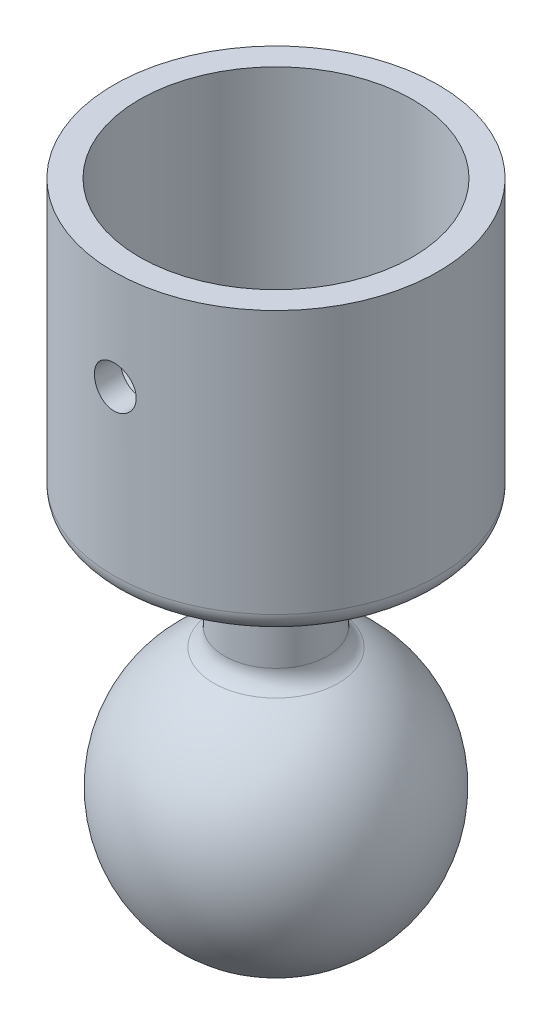
ISO-10303-21;
HEADER;
FILE_DESCRIPTION(('STEP AP214'),'2;1');
FILE_NAME('part.step','',(''),(''),'','','');
FILE_SCHEMA(('AUTOMOTIVE_DESIGN { 1 0 10303 214 1 1 1 1 }'));
ENDSEC;
DATA;
#1=APPLICATION_CONTEXT('core data for automotive mechanical design processes');
#2=APPLICATION_PROTOCOL_DEFINITION('international standard','automotive_design',2000,#1);
#3=PRODUCT_CONTEXT('',#1,'mechanical');
#4=PRODUCT('Part','Part','',(#3));
#5=PRODUCT_RELATED_PRODUCT_CATEGORY('part','',(#4));
#6=PRODUCT_DEFINITION_FORMATION('','',#4);
#7=PRODUCT_DEFINITION_CONTEXT('part definition',#1,'design');
#8=PRODUCT_DEFINITION('design','',#6,#7);
#9=PRODUCT_DEFINITION_SHAPE('','',#8);
#10=(LENGTH_UNIT() NAMED_UNIT(*) SI_UNIT(.MILLI.,.METRE.));
#11=(NAMED_UNIT(*) PLANE_ANGLE_UNIT() SI_UNIT($,.RADIAN.));
#12=(NAMED_UNIT(*) SI_UNIT($,.STERADIAN.) SOLID_ANGLE_UNIT());
#13=UNCERTAINTY_MEASURE_WITH_UNIT(LENGTH_MEASURE(1.E-05),#10,'distance_accuracy_value','');
#14=(GEOMETRIC_REPRESENTATION_CONTEXT(3) GLOBAL_UNCERTAINTY_ASSIGNED_CONTEXT((#13)) GLOBAL_UNIT_ASSIGNED_CONTEXT((#10,
#11,#12)) REPRESENTATION_CONTEXT('',''));
#15=CARTESIAN_POINT('',(0.,0.,0.));
#16=DIRECTION('',(0.,0.,1.));
#17=DIRECTION('',(1.,0.,0.));
#18=AXIS2_PLACEMENT_3D('',#15,#16,#17);
#19=CARTESIAN_POINT('',(0.,40.,0.));
#20=DIRECTION('',(0.,-1.,0.));
#21=DIRECTION('',(0.,0.,-1.));
#22=AXIS2_PLACEMENT_3D('',#19,#20,#21);
#23=CYLINDRICAL_SURFACE('',#22,20.);
#24=CARTESIAN_POINT('',(0.,32.5,0.));
#25=DIRECTION('',(0.,1.,0.));
#26=DIRECTION('',(0.,0.,1.));
#27=AXIS2_PLACEMENT_3D('',#24,#25,#26);
#28=CIRCLE('',#27,20.);
#29=CARTESIAN_POINT('',(0.,32.5,20.));
#30=VERTEX_POINT('',#29);
#31=EDGE_CURVE('E51',#30,#30,#28,.T.);
#32=ORIENTED_EDGE('',*,*,#31,.T.);
#33=EDGE_LOOP('',(#32));
#34=FACE_BOUND('',#33,.T.);
#35=CARTESIAN_POINT('',(0.,65.,0.));
#36=DIRECTION('',(0.,1.,0.));
#37=DIRECTION('',(0.,0.,1.));
#38=AXIS2_PLACEMENT_3D('',#35,#36,#37);
#39=CIRCLE('',#38,20.);
#40=CARTESIAN_POINT('',(0.,65.,20.));
#41=VERTEX_POINT('',#40);
#42=EDGE_CURVE('E63',#41,#41,#39,.T.);
#43=ORIENTED_EDGE('',*,*,#42,.F.);
#44=EDGE_LOOP('',(#43));
#45=FACE_BOUND('',#44,.T.);
#46=CARTESIAN_POINT('',(0.,50.1203125,20.));
#47=CARTESIAN_POINT('',(0.144259684089604,50.1203186046684,19.9999979355658));
#48=CARTESIAN_POINT('',(0.288608567722076,50.1324541088101,19.9984227203245));
#49=CARTESIAN_POINT('',(0.57328694042105,50.1806719405937,19.9922904047066));
#50=CARTESIAN_POINT('',(0.713612117704079,50.2167790240216,19.9877302217806));
#51=CARTESIAN_POINT('',(0.986080772686099,50.3118562299888,19.9761415135883));
#52=CARTESIAN_POINT('',(1.11822978622637,50.3708106823734,19.9691146804156));
#53=CARTESIAN_POINT('',(1.37073416617991,50.5098742330933,19.9533734489139));
#54=CARTESIAN_POINT('',(1.49109149384735,50.5899798052472,19.9446593319427));
#55=CARTESIAN_POINT('',(1.71732404484239,50.7695721164172,19.9264589155304));
#56=CARTESIAN_POINT('',(1.82312037976386,50.8691578568412,19.9169688222111));
#57=CARTESIAN_POINT('',(2.01654817617346,51.0846709675932,19.8983165014246));
#58=CARTESIAN_POINT('',(2.10417869520908,51.200599185254,19.8891542909885));
#59=CARTESIAN_POINT('',(2.25908326694745,51.4460218544909,19.8721578766512));
#60=CARTESIAN_POINT('',(2.32628303386291,51.57556356128,19.8643285634699));
#61=CARTESIAN_POINT('',(2.43794409501457,51.8442116395449,19.8509347478902));
#62=CARTESIAN_POINT('',(2.48240630634559,51.9833176249991,19.8453701541487));
#63=CARTESIAN_POINT('',(2.54708958715884,52.2663249936135,19.837172241303));
#64=CARTESIAN_POINT('',(2.56744416471193,52.4101953869017,19.8345227840315));
#65=CARTESIAN_POINT('',(2.58374757667867,52.6993325245959,19.8324058050349));
#66=CARTESIAN_POINT('',(2.57969745403279,52.8445992090662,19.8329381473349));
#67=CARTESIAN_POINT('',(2.54741595459848,53.1314730438549,19.8371098511547));
#68=CARTESIAN_POINT('',(2.5193318809142,53.2730970844133,19.8407302854398));
#69=CARTESIAN_POINT('',(2.44000962377564,53.5496053548005,19.8506407147159));
#70=CARTESIAN_POINT('',(2.38877094348664,53.6844894399393,19.8569307669896));
#71=CARTESIAN_POINT('',(2.26443638275144,53.9441451538924,19.8714930816405));
#72=CARTESIAN_POINT('',(2.19127673027484,54.068885909094,19.8797711132632));
#73=CARTESIAN_POINT('',(2.02522254887564,54.3043756367099,19.8973722462461));
#74=CARTESIAN_POINT('',(1.93232705916395,54.415123927518,19.9066953984749));
#75=CARTESIAN_POINT('',(1.7286229537854,54.620339798171,19.9254203525415));
#76=CARTESIAN_POINT('',(1.61768741696047,54.7146814308242,19.9348222278098));
#77=CARTESIAN_POINT('',(1.38148861925346,54.8834245104817,19.9525810859224));
#78=CARTESIAN_POINT('',(1.25622532158365,54.957825906286,19.9609380660839));
#79=CARTESIAN_POINT('',(0.994827864690191,55.0845775601328,19.9756711983466));
#80=CARTESIAN_POINT('',(0.858689706852809,55.136919662311,19.9820466175877));
#81=CARTESIAN_POINT('',(0.579455954793333,55.2179655479392,19.9920917353578));
#82=CARTESIAN_POINT('',(0.436360707899851,55.2466705101791,19.995761568814));
#83=CARTESIAN_POINT('',(0.148363430686238,55.27946342583,19.9999644376216));
#84=CARTESIAN_POINT('',(0.0034814598698716,55.283724825918,20.0005195736327));
#85=CARTESIAN_POINT('',(-0.284930877059284,55.2679677712994,19.9984902419318));
#86=CARTESIAN_POINT('',(-0.428461273790265,55.2479498679496,19.9959058455152));
#87=CARTESIAN_POINT('',(-0.709582370288303,55.1843465561075,19.9879015871917));
#88=CARTESIAN_POINT('',(-0.847192149932119,55.1408441154564,19.9824917095215));
#89=CARTESIAN_POINT('',(-1.11316341629269,55.0315930443956,19.9694419866011));
#90=CARTESIAN_POINT('',(-1.24152457038789,54.9658436143696,19.9618020611984));
#91=CARTESIAN_POINT('',(-1.4861277538227,54.8135471890215,19.9450884901062));
#92=CARTESIAN_POINT('',(-1.60229959611558,54.7268883170114,19.9360072250942));
#93=CARTESIAN_POINT('',(-1.81851173147554,54.5353908354827,19.9174499633749));
#94=CARTESIAN_POINT('',(-1.91855134074004,54.4305514557314,19.9079739499567));
#95=CARTESIAN_POINT('',(-2.1002769737112,54.2049037084931,19.8896267261291));
#96=CARTESIAN_POINT('',(-2.18184782719895,54.0840022134656,19.8807595388864));
#97=CARTESIAN_POINT('',(-2.32352409072991,53.8301127942107,19.8647008799258));
#98=CARTESIAN_POINT('',(-2.38362995436432,53.6971251254589,19.8575093727991));
#99=CARTESIAN_POINT('',(-2.48048476164498,53.4232058275026,19.8456440026552));
#100=CARTESIAN_POINT('',(-2.51729799828203,53.282297244399,19.8409632149697));
#101=CARTESIAN_POINT('',(-2.56672927631033,52.996233951436,19.834629618848));
#102=CARTESIAN_POINT('',(-2.57934852229131,52.8510794533409,19.8329766596601));
#103=CARTESIAN_POINT('',(-2.58001053460691,52.5617908061595,19.8328904574174));
#104=CARTESIAN_POINT('',(-2.56823425374488,52.4176570448908,19.8344335080784));
#105=CARTESIAN_POINT('',(-2.52082336128995,52.133436021762,19.8405144140881));
#106=CARTESIAN_POINT('',(-2.48518875239719,51.993348759444,19.845052269098));
#107=CARTESIAN_POINT('',(-2.39113044257469,51.7212250328605,19.8566040077216));
#108=CARTESIAN_POINT('',(-2.33271604685648,51.5891853067262,19.8636168802158));
#109=CARTESIAN_POINT('',(-2.19477412073822,51.3367526138156,19.8793300765957));
#110=CARTESIAN_POINT('',(-2.11524625827741,51.2163598302565,19.8880304270207));
#111=CARTESIAN_POINT('',(-1.93666548925043,50.9897142735576,19.906215529831));
#112=CARTESIAN_POINT('',(-1.83747781495568,50.883568091808,19.9157054182349));
#113=CARTESIAN_POINT('',(-1.62267509948175,50.6893583265491,19.9343553319995));
#114=CARTESIAN_POINT('',(-1.50705620000392,50.6012990020152,19.9435152792501));
#115=CARTESIAN_POINT('',(-1.26213407745754,50.4454566910302,19.9605144089472));
#116=CARTESIAN_POINT('',(-1.1327774026676,50.3777571473775,19.9683481000762));
#117=CARTESIAN_POINT('',(-0.864500555958517,50.2651396143564,19.9817567924104));
#118=CARTESIAN_POINT('',(-0.725590889315517,50.2201970405049,19.9873342297434));
#119=CARTESIAN_POINT('',(-0.488313325320549,50.1650448423145,19.9942679251742));
#120=CARTESIAN_POINT('',(-0.391437409634517,50.1482945437591,19.9964068984281));
#121=CARTESIAN_POINT('',(-0.19638810409893,50.1259263392644,19.9992736329212));
#122=CARTESIAN_POINT('',(-0.0982147246868387,50.1203083438261,20.0000014055059));
#123=CARTESIAN_POINT('',(0.,50.1203125,20.));
#124=B_SPLINE_CURVE_WITH_KNOTS('',3,(#46,#47,#48,#49,#50,#51,#52,#53,#54,#55,#56,#57,#58,#59,
#60,#61,#62,#63,#64,#65,#66,#67,#68,#69,#70,#71,#72,#73,#74,#75,#76,#77,#78,#79,#80,#81,#82,#83,
#84,#85,#86,#87,#88,#89,#90,#91,#92,#93,#94,#95,#96,#97,#98,#99,#100,#101,#102,#103,#104,#105,
#106,#107,#108,#109,#110,#111,#112,#113,#114,#115,#116,#117,#118,#119,#120,#121,#122,#123),
.UNSPECIFIED.,.T.,.F.,(4,2,2,2,2,2,2,2,2,2,2,2,2,2,2,2,2,2,2,2,2,2,2,2,2,2,2,2,2,2,2,2,2,2,2,2,
2,2,4),(0.,0.432420284850133,0.865287832278834,1.29785901599462,1.73035812965382,
2.1651152260535,2.59989487224849,3.03623696604836,3.47256145907105,3.90645811724559,
4.34033623287797,4.77157401739153,5.20282105553137,5.63533505466974,6.06787011448015,
6.50359157764934,6.9393141595949,7.3751976978846,7.81105949724396,8.24382464462087,
8.67657996455437,9.10781632654163,9.5390681899662,9.97268074705462,10.4063116790014,
10.8425764792745,11.2788320599957,11.7138781609775,12.1489026009739,12.5807118218453,
13.0125209938474,13.4441539625367,13.8757937201092,14.3105016142397,14.7453117534964,
15.1818803720755,15.617976351481,15.912378636772,16.2067785551802),.UNSPECIFIED.);
#125=CARTESIAN_POINT('',(0.,50.1203125,20.));
#126=VERTEX_POINT('',#125);
#127=EDGE_CURVE('E69',#126,#126,#124,.T.);
#128=ORIENTED_EDGE('',*,*,#127,.F.);
#129=EDGE_LOOP('',(#128));
#130=FACE_BOUND('',#129,.T.);
#131=ADVANCED_FACE('F30',(#34,#45,#130),#23,.T.);
#132=CARTESIAN_POINT('',(0.,65.,0.));
#133=DIRECTION('',(0.,-1.,0.));
#134=DIRECTION('',(0.,0.,-1.));
#135=AXIS2_PLACEMENT_3D('',#132,#133,#134);
#136=CYLINDRICAL_SURFACE('',#135,16.85);
#137=CARTESIAN_POINT('',(0.,40.,0.));
#138=DIRECTION('',(0.,1.,0.));
#139=DIRECTION('',(0.,0.,1.));
#140=AXIS2_PLACEMENT_3D('',#137,#138,#139);
#141=CIRCLE('',#140,16.85);
#142=CARTESIAN_POINT('',(0.,40.,16.85));
#143=VERTEX_POINT('',#142);
#144=EDGE_CURVE('E54',#143,#143,#141,.F.);
#145=ORIENTED_EDGE('',*,*,#144,.T.);
#146=EDGE_LOOP('',(#145));
#147=FACE_BOUND('',#146,.T.);
#148=CARTESIAN_POINT('',(0.,65.,0.));
#149=DIRECTION('',(0.,1.,0.));
#150=DIRECTION('',(0.,0.,1.));
#151=AXIS2_PLACEMENT_3D('',#148,#149,#150);
#152=CIRCLE('',#151,16.85);
#153=CARTESIAN_POINT('',(0.,65.,16.85));
#154=VERTEX_POINT('',#153);
#155=EDGE_CURVE('E66',#154,#154,#152,.T.);
#156=ORIENTED_EDGE('',*,*,#155,.T.);
#157=EDGE_LOOP('',(#156));
#158=FACE_BOUND('',#157,.T.);
#159=CARTESIAN_POINT('',(-2.5796875,52.7,16.6513576744464));
#160=CARTESIAN_POINT('',(-2.57968157967421,52.5560117891578,16.6513601193928));
#161=CARTESIAN_POINT('',(-2.56759142326191,52.4119408757347,16.6532455388782));
#162=CARTESIAN_POINT('',(-2.5195645331354,52.1278296639703,16.6605780818208));
#163=CARTESIAN_POINT('',(-2.48360476566806,51.9877933953154,16.6660286455049));
#164=CARTESIAN_POINT('',(-2.38894189563946,51.7159049080579,16.6798599924652));
#165=CARTESIAN_POINT('',(-2.3302565234872,51.5840464020199,16.6882384908847));
#166=CARTESIAN_POINT('',(-2.19185050225866,51.332065831323,16.706978951984));
#167=CARTESIAN_POINT('',(-2.11213265451573,51.2119422066027,16.7173406504694));
#168=CARTESIAN_POINT('',(-1.93321511380975,50.9858221759533,16.7389765637315));
#169=CARTESIAN_POINT('',(-1.83387460944099,50.8799377686702,16.7502570056408));
#170=CARTESIAN_POINT('',(-1.61883577654572,50.6862728029344,16.7724038523746));
#171=CARTESIAN_POINT('',(-1.50313653700671,50.5984932534051,16.7832702340974));
#172=CARTESIAN_POINT('',(-1.25794550140128,50.4431152003564,16.8034299033076));
#173=CARTESIAN_POINT('',(-1.12838749238576,50.3756200343325,16.812715034675));
#174=CARTESIAN_POINT('',(-0.859607783480885,50.2633900293106,16.82859699072));
#175=CARTESIAN_POINT('',(-0.72038661555025,50.2186539385488,16.8351939632441));
#176=CARTESIAN_POINT('',(-0.437386706365017,50.1535520497785,16.8449123654646));
#177=CARTESIAN_POINT('',(-0.293652070425817,50.1329985826942,16.8480605461379));
#178=CARTESIAN_POINT('',(-0.0047420001546173,50.1162625023987,16.8506183742518));
#179=CARTESIAN_POINT('',(0.140433350417029,50.1200784805871,16.8500282377743));
#180=CARTESIAN_POINT('',(0.426822972858375,50.1518251788889,16.8451972629109));
#181=CARTESIAN_POINT('',(0.568060216171563,50.1795539846139,16.8409869929724));
#182=CARTESIAN_POINT('',(0.843853119854773,50.2580220993676,16.8294228758527));
#183=CARTESIAN_POINT('',(0.978408602356649,50.3087620205872,16.8220689450375));
#184=CARTESIAN_POINT('',(1.23762769104119,50.4320176731761,16.8049913420397));
#185=CARTESIAN_POINT('',(1.36225040292763,50.5046180846612,16.7952584828073));
#186=CARTESIAN_POINT('',(1.59762049691591,50.6694719958899,16.7745071444088));
#187=CARTESIAN_POINT('',(1.70836692734892,50.7617268424117,16.7634885771657));
#188=CARTESIAN_POINT('',(1.9140314902412,50.9643947945324,16.7412608066833));
#189=CARTESIAN_POINT('',(2.00877586574088,51.0749842233435,16.7300508068331));
#190=CARTESIAN_POINT('',(2.17838917601242,51.3105839390219,16.708813541843));
#191=CARTESIAN_POINT('',(2.2532579785036,51.435594321859,16.698786284575));
#192=CARTESIAN_POINT('',(2.38102026538037,51.6966721046894,16.6810499222785));
#193=CARTESIAN_POINT('',(2.43389534492257,51.8327486517282,16.6733427602421));
#194=CARTESIAN_POINT('',(2.51599155658888,52.111995338699,16.6611531816711));
#195=CARTESIAN_POINT('',(2.54521442899459,52.2551649559145,16.6566705278865));
#196=CARTESIAN_POINT('',(2.5789372602295,52.542986228322,16.6514826692861));
#197=CARTESIAN_POINT('',(2.58368377694979,52.6876083396462,16.6507397943391));
#198=CARTESIAN_POINT('',(2.56897389237175,52.9755823392936,16.6530155343492));
#199=CARTESIAN_POINT('',(2.54951827454785,53.1189342685839,16.6560340275428));
#200=CARTESIAN_POINT('',(2.48716570709591,53.3995313782231,16.6654577553682));
#201=CARTESIAN_POINT('',(2.44439206836594,53.5368046109532,16.6718451686736));
#202=CARTESIAN_POINT('',(2.33674610487353,53.8022333358894,16.6872722925654));
#203=CARTESIAN_POINT('',(2.27187264702997,53.930388360188,16.6963121391416));
#204=CARTESIAN_POINT('',(2.12127804855136,54.1750466539058,16.7161140969022));
#205=CARTESIAN_POINT('',(2.03539758917819,54.2914507926094,16.7268891438742));
#206=CARTESIAN_POINT('',(1.84544779389639,54.5082829474892,16.7489086676992));
#207=CARTESIAN_POINT('',(1.74137738513499,54.608710020662,16.7601531722112));
#208=CARTESIAN_POINT('',(1.51691486460429,54.7916254075028,16.781962624799));
#209=CARTESIAN_POINT('',(1.39638869410322,54.8739501380958,16.7925208134363));
#210=CARTESIAN_POINT('',(1.14307426939715,55.0171831540418,16.8116623765315));
#211=CARTESIAN_POINT('',(1.01028636209344,55.0780920450438,16.8202458068339));
#212=CARTESIAN_POINT('',(0.736724124830476,55.1765042378415,16.8344411588415));
#213=CARTESIAN_POINT('',(0.595982332541899,55.2140962942127,16.8400643361023));
#214=CARTESIAN_POINT('',(0.310091151156388,55.2650947076306,16.8477529105713));
#215=CARTESIAN_POINT('',(0.164942066548349,55.2785027316436,16.8498185529942));
#216=CARTESIAN_POINT('',(-0.124058259668895,55.2807104902222,16.850156678919));
#217=CARTESIAN_POINT('',(-0.267907608346202,55.2697602670688,16.8484677044299));
#218=CARTESIAN_POINT('',(-0.551693648926051,55.2240991901315,16.8415642602314));
#219=CARTESIAN_POINT('',(-0.691630354903202,55.1893884218307,16.8363498032057));
#220=CARTESIAN_POINT('',(-0.963545346548327,55.0972815892991,16.8229786717156));
#221=CARTESIAN_POINT('',(-1.09552985920403,55.0399035479742,16.8148243352187));
#222=CARTESIAN_POINT('',(-1.34803730890427,54.9041177862351,16.7964681050336));
#223=CARTESIAN_POINT('',(-1.46855984255124,54.8257093260386,16.7862661393195));
#224=CARTESIAN_POINT('',(-1.69598887741392,54.6491874502967,16.7648237540217));
#225=CARTESIAN_POINT('',(-1.80275143757677,54.5508896753464,16.7535741936668));
#226=CARTESIAN_POINT('',(-1.99835664189189,54.3377673383239,16.7313713398338));
#227=CARTESIAN_POINT('',(-2.08719507707872,54.2229389053237,16.7204181164635));
#228=CARTESIAN_POINT('',(-2.24490073995654,53.9792204426527,16.6999790428046));
#229=CARTESIAN_POINT('',(-2.31364764709779,53.8502518108205,16.6905021855719));
#230=CARTESIAN_POINT('',(-2.42840046541223,53.5825123558706,16.6741944207696));
#231=CARTESIAN_POINT('',(-2.47442982022739,53.4437518074219,16.667360787077));
#232=CARTESIAN_POINT('',(-2.5320743595584,53.203651991667,16.6586807975601));
#233=CARTESIAN_POINT('',(-2.54990173420719,53.1037907173974,16.6559493117517));
#234=CARTESIAN_POINT('',(-2.57371030593733,52.9026332701896,16.6522869022691));
#235=CARTESIAN_POINT('',(-2.57969166665187,52.8013371170912,16.6513559537234));
#236=CARTESIAN_POINT('',(-2.5796875,52.7,16.6513576744464));
#237=B_SPLINE_CURVE_WITH_KNOTS('',3,(#159,#160,#161,#162,#163,#164,#165,#166,#167,#168,#169,
#170,#171,#172,#173,#174,#175,#176,#177,#178,#179,#180,#181,#182,#183,#184,#185,#186,#187,#188,
#189,#190,#191,#192,#193,#194,#195,#196,#197,#198,#199,#200,#201,#202,#203,#204,#205,#206,#207,
#208,#209,#210,#211,#212,#213,#214,#215,#216,#217,#218,#219,#220,#221,#222,#223,#224,#225,#226,
#227,#228,#229,#230,#231,#232,#233,#234,#235,#236),.UNSPECIFIED.,.T.,.F.,(4,2,2,2,2,2,2,2,2,2,2,
2,2,2,2,2,2,2,2,2,2,2,2,2,2,2,2,2,2,2,2,2,2,2,2,2,2,2,4),(0.,0.43159420374436,0.863605494912892,
1.29528040979586,1.72689785852863,2.16173312695301,2.59659262075331,3.03363132181571,
3.47064598286757,3.90424634433128,4.33782164309501,4.76777138356791,5.19773256315312,
5.629381174259,6.06105937268234,6.4971594487158,6.93326242711418,7.36972961567811,
7.80616468694837,8.23819470296168,8.67021073361109,9.09996402132547,9.52973934626268,
9.96288108414527,10.3960483775813,10.832982346047,11.2699039568387,11.7051520695721,
12.1403701802072,12.5711413273695,13.0019109247568,13.4323387013862,13.8627816210651,
14.2974140134809,14.7321483483374,15.1694351626039,15.6062697651583,15.9100246091518,
16.2137752572425),.UNSPECIFIED.);
#238=CARTESIAN_POINT('',(-2.5796875,52.7,16.6513576744464));
#239=VERTEX_POINT('',#238);
#240=EDGE_CURVE('E34',#239,#239,#237,.T.);
#241=ORIENTED_EDGE('',*,*,#240,.T.);
#242=EDGE_LOOP('',(#241));
#243=FACE_BOUND('',#242,.T.);
#244=ADVANCED_FACE('F81',(#147,#158,#243),#136,.F.);
#245=CARTESIAN_POINT('',(0.,0.,0.));
#246=DIRECTION('',(0.,0.,-1.));
#247=DIRECTION('',(1.,0.,0.));
#248=AXIS2_PLACEMENT_3D('',#245,#246,#247);
#249=SPHERICAL_SURFACE('',#248,16.75);
#250=CARTESIAN_POINT('',(0.,0.,0.));
#251=DIRECTION('',(0.,-1.,0.));
#252=DIRECTION('',(0.,0.,-1.));
#253=AXIS2_PLACEMENT_3D('',#250,#251,#252);
#254=SPHERICAL_SURFACE('',#253,16.75);
#255=CARTESIAN_POINT('',(0.,14.8748949434389,0.));
#256=DIRECTION('',(0.,-1.,0.));
#257=DIRECTION('',(0.,0.,-1.));
#258=AXIS2_PLACEMENT_3D('',#255,#256,#257);
#259=CIRCLE('',#258,7.70064935064935);
#260=CARTESIAN_POINT('',(0.,14.8748949434389,-7.70064935064935));
#261=VERTEX_POINT('',#260);
#262=EDGE_CURVE('E10',#261,#261,#259,.T.);
#263=ORIENTED_EDGE('',*,*,#262,.T.);
#264=EDGE_LOOP('',(#263));
#265=FACE_BOUND('',#264,.T.);
#266=ADVANCED_FACE('F86',(#265),#254,.T.);
#267=CARTESIAN_POINT('',(0.,30.,0.));
#268=DIRECTION('',(0.,-1.,0.));
#269=DIRECTION('',(0.,0.,-1.));
#270=AXIS2_PLACEMENT_3D('',#267,#268,#269);
#271=CYLINDRICAL_SURFACE('',#270,6.35);
#272=CARTESIAN_POINT('',(0.,17.0950285170865,0.));
#273=DIRECTION('',(0.,-1.,0.));
#274=DIRECTION('',(0.,0.,-1.));
#275=AXIS2_PLACEMENT_3D('',#272,#273,#274);
#276=CIRCLE('',#275,6.35);
#277=CARTESIAN_POINT('',(0.,17.0950285170865,-6.35));
#278=VERTEX_POINT('',#277);
#279=EDGE_CURVE('E42',#278,#278,#276,.F.);
#280=ORIENTED_EDGE('',*,*,#279,.T.);
#281=EDGE_LOOP('',(#280));
#282=FACE_BOUND('',#281,.T.);
#283=CARTESIAN_POINT('',(0.,26.1,0.));
#284=DIRECTION('',(0.,1.,0.));
#285=DIRECTION('',(0.,0.,1.));
#286=AXIS2_PLACEMENT_3D('',#283,#284,#285);
#287=CIRCLE('',#286,6.35);
#288=CARTESIAN_POINT('',(0.,26.1,6.35));
#289=VERTEX_POINT('',#288);
#290=EDGE_CURVE('E57',#289,#289,#287,.F.);
#291=ORIENTED_EDGE('',*,*,#290,.T.);
#292=EDGE_LOOP('',(#291));
#293=FACE_BOUND('',#292,.T.);
#294=ADVANCED_FACE('F99',(#282,#293),#271,.T.);
#295=CARTESIAN_POINT('',(0.,30.,0.));
#296=DIRECTION('',(0.,1.,0.));
#297=DIRECTION('',(0.,0.,1.));
#298=AXIS2_PLACEMENT_3D('',#295,#296,#297);
#299=PLANE('',#298);
#300=CARTESIAN_POINT('',(0.,30.,0.));
#301=DIRECTION('',(0.,1.,0.));
#302=DIRECTION('',(0.,0.,1.));
#303=AXIS2_PLACEMENT_3D('',#300,#301,#302);
#304=CIRCLE('',#303,17.5);
#305=CARTESIAN_POINT('',(0.,30.,17.5));
#306=VERTEX_POINT('',#305);
#307=EDGE_CURVE('E46',#306,#306,#304,.F.);
#308=ORIENTED_EDGE('',*,*,#307,.T.);
#309=EDGE_LOOP('',(#308));
#310=FACE_BOUND('',#309,.T.);
#311=CARTESIAN_POINT('',(0.,30.,0.));
#312=DIRECTION('',(0.,1.,0.));
#313=DIRECTION('',(0.,0.,1.));
#314=AXIS2_PLACEMENT_3D('',#311,#312,#313);
#315=CIRCLE('',#314,10.25);
#316=CARTESIAN_POINT('',(0.,30.,10.25));
#317=VERTEX_POINT('',#316);
#318=EDGE_CURVE('E60',#317,#317,#315,.T.);
#319=ORIENTED_EDGE('',*,*,#318,.T.);
#320=EDGE_LOOP('',(#319));
#321=FACE_BOUND('',#320,.T.);
#322=ADVANCED_FACE('F97',(#310,#321),#299,.F.);
#323=CARTESIAN_POINT('',(0.,26.1,0.));
#324=DIRECTION('',(0.,1.,0.));
#325=DIRECTION('',(0.,0.,1.));
#326=AXIS2_PLACEMENT_3D('',#323,#324,#325);
#327=TOROIDAL_SURFACE('',#326,10.25,3.9);
#328=ORIENTED_EDGE('',*,*,#290,.F.);
#329=EDGE_LOOP('',(#328));
#330=FACE_BOUND('',#329,.T.);
#331=ORIENTED_EDGE('',*,*,#318,.F.);
#332=EDGE_LOOP('',(#331));
#333=FACE_BOUND('',#332,.T.);
#334=ADVANCED_FACE('F92',(#330,#333),#327,.F.);
#335=CARTESIAN_POINT('',(0.,65.,0.));
#336=DIRECTION('',(0.,1.,0.));
#337=DIRECTION('',(0.,0.,1.));
#338=AXIS2_PLACEMENT_3D('',#335,#336,#337);
#339=PLANE('',#338);
#340=ORIENTED_EDGE('',*,*,#42,.T.);
#341=EDGE_LOOP('',(#340));
#342=FACE_BOUND('',#341,.T.);
#343=ORIENTED_EDGE('',*,*,#155,.F.);
#344=EDGE_LOOP('',(#343));
#345=FACE_BOUND('',#344,.T.);
#346=ADVANCED_FACE('F88',(#342,#345),#339,.T.);
#347=CARTESIAN_POINT('',(0.,40.,0.));
#348=DIRECTION('',(0.,1.,0.));
#349=DIRECTION('',(0.,0.,1.));
#350=AXIS2_PLACEMENT_3D('',#347,#348,#349);
#351=PLANE('',#350);
#352=ORIENTED_EDGE('',*,*,#144,.F.);
#353=EDGE_LOOP('',(#352));
#354=FACE_BOUND('',#353,.T.);
#355=ADVANCED_FACE('F91',(#354),#351,.T.);
#356=CARTESIAN_POINT('',(0.,32.5,0.));
#357=DIRECTION('',(0.,1.,0.));
#358=DIRECTION('',(0.,0.,1.));
#359=AXIS2_PLACEMENT_3D('',#356,#357,#358);
#360=TOROIDAL_SURFACE('',#359,17.5,2.5);
#361=ORIENTED_EDGE('',*,*,#307,.F.);
#362=EDGE_LOOP('',(#361));
#363=FACE_BOUND('',#362,.T.);
#364=ORIENTED_EDGE('',*,*,#31,.F.);
#365=EDGE_LOOP('',(#364));
#366=FACE_BOUND('',#365,.T.);
#367=ADVANCED_FACE('F95',(#363,#366),#360,.T.);
#368=CARTESIAN_POINT('',(0.,17.0950285170865,0.));
#369=DIRECTION('',(0.,-1.,0.));
#370=DIRECTION('',(0.,0.,-1.));
#371=AXIS2_PLACEMENT_3D('',#368,#369,#370);
#372=TOROIDAL_SURFACE('',#371,8.85,2.5);
#373=ORIENTED_EDGE('',*,*,#262,.F.);
#374=EDGE_LOOP('',(#373));
#375=FACE_BOUND('',#374,.T.);
#376=ORIENTED_EDGE('',*,*,#279,.F.);
#377=EDGE_LOOP('',(#376));
#378=FACE_BOUND('',#377,.T.);
#379=ADVANCED_FACE('F32',(#375,#378),#372,.F.);
#380=CARTESIAN_POINT('',(0.,52.7,20.));
#381=DIRECTION('',(0.,0.,-1.));
#382=DIRECTION('',(-1.,0.,0.));
#383=AXIS2_PLACEMENT_3D('',#380,#381,#382);
#384=CYLINDRICAL_SURFACE('',#383,2.5796875);
#385=ORIENTED_EDGE('',*,*,#240,.F.);
#386=EDGE_LOOP('',(#385));
#387=FACE_BOUND('',#386,.T.);
#388=ORIENTED_EDGE('',*,*,#127,.T.);
#389=EDGE_LOOP('',(#388));
#390=FACE_BOUND('',#389,.T.);
#391=ADVANCED_FACE('F77',(#387,#390),#384,.F.);
#392=CLOSED_SHELL('',(#131,#244,#266,#294,#322,#334,#346,#355,#367,#379,#391));
#393=MANIFOLD_SOLID_BREP('B2',#392);
#394=ADVANCED_BREP_SHAPE_REPRESENTATION('',(#18,#393),#14);
#395=SHAPE_DEFINITION_REPRESENTATION(#9,#394);
ENDSEC;
END-ISO-10303-21;
